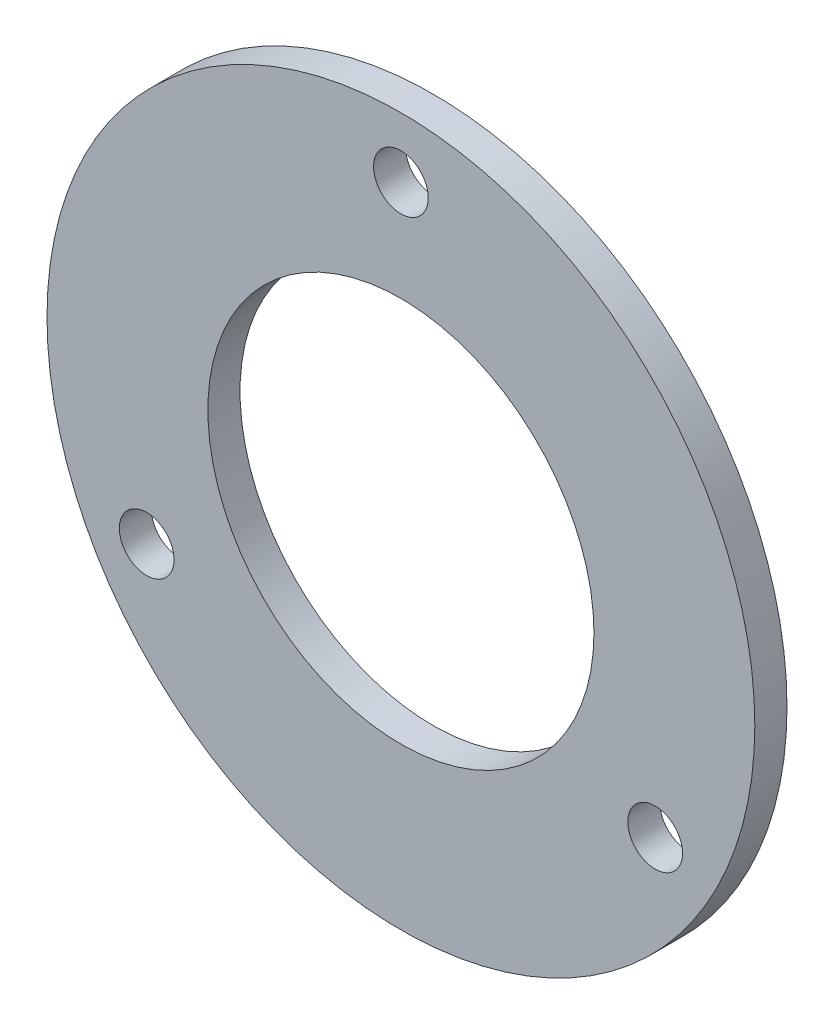
ISO-10303-21;
HEADER;
FILE_DESCRIPTION(('STEP AP214'),'2;1');
FILE_NAME('part.step','',(''),(''),'','','');
FILE_SCHEMA(('AUTOMOTIVE_DESIGN { 1 0 10303 214 1 1 1 1 }'));
ENDSEC;
DATA;
#1=APPLICATION_CONTEXT('core data for automotive mechanical design processes');
#2=APPLICATION_PROTOCOL_DEFINITION('international standard','automotive_design',2000,#1);
#3=PRODUCT_CONTEXT('',#1,'mechanical');
#4=PRODUCT('Part','Part','',(#3));
#5=PRODUCT_RELATED_PRODUCT_CATEGORY('part','',(#4));
#6=PRODUCT_DEFINITION_FORMATION('','',#4);
#7=PRODUCT_DEFINITION_CONTEXT('part definition',#1,'design');
#8=PRODUCT_DEFINITION('design','',#6,#7);
#9=PRODUCT_DEFINITION_SHAPE('','',#8);
#10=(LENGTH_UNIT() NAMED_UNIT(*) SI_UNIT(.MILLI.,.METRE.));
#11=(NAMED_UNIT(*) PLANE_ANGLE_UNIT() SI_UNIT($,.RADIAN.));
#12=(NAMED_UNIT(*) SI_UNIT($,.STERADIAN.) SOLID_ANGLE_UNIT());
#13=UNCERTAINTY_MEASURE_WITH_UNIT(LENGTH_MEASURE(1.E-05),#10,'distance_accuracy_value','');
#14=(GEOMETRIC_REPRESENTATION_CONTEXT(3) GLOBAL_UNCERTAINTY_ASSIGNED_CONTEXT((#13)) GLOBAL_UNIT_ASSIGNED_CONTEXT((#10,
#11,#12)) REPRESENTATION_CONTEXT('',''));
#15=CARTESIAN_POINT('',(0.,0.,0.));
#16=DIRECTION('',(0.,0.,1.));
#17=DIRECTION('',(1.,0.,0.));
#18=AXIS2_PLACEMENT_3D('',#15,#16,#17);
#19=CARTESIAN_POINT('',(0.,0.,2.));
#20=DIRECTION('',(0.,0.,1.));
#21=DIRECTION('',(1.,0.,0.));
#22=AXIS2_PLACEMENT_3D('',#19,#20,#21);
#23=PLANE('',#22);
#24=CARTESIAN_POINT('',(0.,18.25,2.));
#25=DIRECTION('',(0.,0.,1.));
#26=DIRECTION('',(1.,0.,0.));
#27=AXIS2_PLACEMENT_3D('',#24,#25,#26);
#28=CIRCLE('',#27,1.7);
#29=CARTESIAN_POINT('',(1.7,18.25,2.));
#30=VERTEX_POINT('',#29);
#31=EDGE_CURVE('E71',#30,#30,#28,.F.);
#32=ORIENTED_EDGE('',*,*,#31,.T.);
#33=EDGE_LOOP('',(#32));
#34=FACE_BOUND('',#33,.T.);
#35=CARTESIAN_POINT('',(-15.804963619066,-9.125,2.));
#36=DIRECTION('',(0.,0.,1.));
#37=DIRECTION('',(1.,0.,0.));
#38=AXIS2_PLACEMENT_3D('',#35,#36,#37);
#39=CIRCLE('',#38,1.7);
#40=CARTESIAN_POINT('',(-14.104963619066,-9.125,2.));
#41=VERTEX_POINT('',#40);
#42=EDGE_CURVE('E62',#41,#41,#39,.F.);
#43=ORIENTED_EDGE('',*,*,#42,.T.);
#44=EDGE_LOOP('',(#43));
#45=FACE_BOUND('',#44,.T.);
#46=CARTESIAN_POINT('',(15.804963619066,-9.12500000000001,2.));
#47=DIRECTION('',(0.,0.,1.));
#48=DIRECTION('',(1.,0.,0.));
#49=AXIS2_PLACEMENT_3D('',#46,#47,#48);
#50=CIRCLE('',#49,1.7);
#51=CARTESIAN_POINT('',(17.504963619066,-9.12500000000001,2.));
#52=VERTEX_POINT('',#51);
#53=EDGE_CURVE('E59',#52,#52,#50,.F.);
#54=ORIENTED_EDGE('',*,*,#53,.T.);
#55=EDGE_LOOP('',(#54));
#56=FACE_BOUND('',#55,.T.);
#57=CARTESIAN_POINT('',(0.,0.,2.));
#58=DIRECTION('',(0.,0.,1.));
#59=DIRECTION('',(1.,0.,0.));
#60=AXIS2_PLACEMENT_3D('',#57,#58,#59);
#61=CIRCLE('',#60,22.);
#62=CARTESIAN_POINT('',(22.,0.,2.));
#63=VERTEX_POINT('',#62);
#64=EDGE_CURVE('E10',#63,#63,#61,.T.);
#65=ORIENTED_EDGE('',*,*,#64,.T.);
#66=EDGE_LOOP('',(#65));
#67=FACE_BOUND('',#66,.T.);
#68=CARTESIAN_POINT('',(0.,0.,2.));
#69=DIRECTION('',(0.,0.,1.));
#70=DIRECTION('',(1.,0.,0.));
#71=AXIS2_PLACEMENT_3D('',#68,#69,#70);
#72=CIRCLE('',#71,12.);
#73=CARTESIAN_POINT('',(12.,0.,2.));
#74=VERTEX_POINT('',#73);
#75=EDGE_CURVE('E49',#74,#74,#72,.T.);
#76=ORIENTED_EDGE('',*,*,#75,.F.);
#77=EDGE_LOOP('',(#76));
#78=FACE_BOUND('',#77,.T.);
#79=ADVANCED_FACE('F40',(#34,#45,#56,#67,#78),#23,.T.);
#80=CARTESIAN_POINT('',(0.,0.,0.));
#81=DIRECTION('',(0.,0.,1.));
#82=DIRECTION('',(1.,0.,0.));
#83=AXIS2_PLACEMENT_3D('',#80,#81,#82);
#84=PLANE('',#83);
#85=CARTESIAN_POINT('',(0.,18.25,0.));
#86=DIRECTION('',(0.,0.,1.));
#87=DIRECTION('',(1.,0.,0.));
#88=AXIS2_PLACEMENT_3D('',#85,#86,#87);
#89=CIRCLE('',#88,1.7);
#90=CARTESIAN_POINT('',(1.7,18.25,0.));
#91=VERTEX_POINT('',#90);
#92=EDGE_CURVE('E41',#91,#91,#89,.F.);
#93=ORIENTED_EDGE('',*,*,#92,.F.);
#94=EDGE_LOOP('',(#93));
#95=FACE_BOUND('',#94,.T.);
#96=CARTESIAN_POINT('',(-15.804963619066,-9.125,0.));
#97=DIRECTION('',(0.,0.,1.));
#98=DIRECTION('',(1.,0.,0.));
#99=AXIS2_PLACEMENT_3D('',#96,#97,#98);
#100=CIRCLE('',#99,1.7);
#101=CARTESIAN_POINT('',(-14.104963619066,-9.125,0.));
#102=VERTEX_POINT('',#101);
#103=EDGE_CURVE('E56',#102,#102,#100,.F.);
#104=ORIENTED_EDGE('',*,*,#103,.F.);
#105=EDGE_LOOP('',(#104));
#106=FACE_BOUND('',#105,.T.);
#107=CARTESIAN_POINT('',(15.804963619066,-9.12500000000001,0.));
#108=DIRECTION('',(0.,0.,1.));
#109=DIRECTION('',(1.,0.,0.));
#110=AXIS2_PLACEMENT_3D('',#107,#108,#109);
#111=CIRCLE('',#110,1.7);
#112=CARTESIAN_POINT('',(17.504963619066,-9.12500000000001,0.));
#113=VERTEX_POINT('',#112);
#114=EDGE_CURVE('E57',#113,#113,#111,.F.);
#115=ORIENTED_EDGE('',*,*,#114,.F.);
#116=EDGE_LOOP('',(#115));
#117=FACE_BOUND('',#116,.T.);
#118=CARTESIAN_POINT('',(0.,0.,0.));
#119=DIRECTION('',(0.,0.,1.));
#120=DIRECTION('',(1.,0.,0.));
#121=AXIS2_PLACEMENT_3D('',#118,#119,#120);
#122=CIRCLE('',#121,22.);
#123=CARTESIAN_POINT('',(22.,0.,0.));
#124=VERTEX_POINT('',#123);
#125=EDGE_CURVE('E44',#124,#124,#122,.T.);
#126=ORIENTED_EDGE('',*,*,#125,.F.);
#127=EDGE_LOOP('',(#126));
#128=FACE_BOUND('',#127,.T.);
#129=CARTESIAN_POINT('',(0.,0.,0.));
#130=DIRECTION('',(0.,0.,1.));
#131=DIRECTION('',(1.,0.,0.));
#132=AXIS2_PLACEMENT_3D('',#129,#130,#131);
#133=CIRCLE('',#132,12.);
#134=CARTESIAN_POINT('',(12.,0.,0.));
#135=VERTEX_POINT('',#134);
#136=EDGE_CURVE('E52',#135,#135,#133,.T.);
#137=ORIENTED_EDGE('',*,*,#136,.T.);
#138=EDGE_LOOP('',(#137));
#139=FACE_BOUND('',#138,.T.);
#140=ADVANCED_FACE('F79',(#95,#106,#117,#128,#139),#84,.F.);
#141=CARTESIAN_POINT('',(0.,0.,2.));
#142=DIRECTION('',(0.,0.,-1.));
#143=DIRECTION('',(-1.,0.,0.));
#144=AXIS2_PLACEMENT_3D('',#141,#142,#143);
#145=CYLINDRICAL_SURFACE('',#144,22.);
#146=ORIENTED_EDGE('',*,*,#64,.F.);
#147=EDGE_LOOP('',(#146));
#148=FACE_BOUND('',#147,.T.);
#149=ORIENTED_EDGE('',*,*,#125,.T.);
#150=EDGE_LOOP('',(#149));
#151=FACE_BOUND('',#150,.T.);
#152=ADVANCED_FACE('F39',(#148,#151),#145,.T.);
#153=CARTESIAN_POINT('',(0.,0.,2.));
#154=DIRECTION('',(0.,0.,-1.));
#155=DIRECTION('',(-1.,0.,0.));
#156=AXIS2_PLACEMENT_3D('',#153,#154,#155);
#157=CYLINDRICAL_SURFACE('',#156,12.);
#158=ORIENTED_EDGE('',*,*,#75,.T.);
#159=EDGE_LOOP('',(#158));
#160=FACE_BOUND('',#159,.T.);
#161=ORIENTED_EDGE('',*,*,#136,.F.);
#162=EDGE_LOOP('',(#161));
#163=FACE_BOUND('',#162,.T.);
#164=ADVANCED_FACE('F82',(#160,#163),#157,.F.);
#165=CARTESIAN_POINT('',(15.804963619066,-9.12500000000001,3.));
#166=DIRECTION('',(0.,0.,-1.));
#167=DIRECTION('',(-1.,0.,0.));
#168=AXIS2_PLACEMENT_3D('',#165,#166,#167);
#169=CYLINDRICAL_SURFACE('',#168,1.7);
#170=ORIENTED_EDGE('',*,*,#53,.F.);
#171=EDGE_LOOP('',(#170));
#172=FACE_BOUND('',#171,.T.);
#173=ORIENTED_EDGE('',*,*,#114,.T.);
#174=EDGE_LOOP('',(#173));
#175=FACE_BOUND('',#174,.T.);
#176=ADVANCED_FACE('F84',(#172,#175),#169,.F.);
#177=CARTESIAN_POINT('',(-15.804963619066,-9.125,3.));
#178=DIRECTION('',(0.,0.,-1.));
#179=DIRECTION('',(-1.,0.,0.));
#180=AXIS2_PLACEMENT_3D('',#177,#178,#179);
#181=CYLINDRICAL_SURFACE('',#180,1.7);
#182=ORIENTED_EDGE('',*,*,#42,.F.);
#183=EDGE_LOOP('',(#182));
#184=FACE_BOUND('',#183,.T.);
#185=ORIENTED_EDGE('',*,*,#103,.T.);
#186=EDGE_LOOP('',(#185));
#187=FACE_BOUND('',#186,.T.);
#188=ADVANCED_FACE('F86',(#184,#187),#181,.F.);
#189=CARTESIAN_POINT('',(0.,18.25,3.));
#190=DIRECTION('',(0.,0.,-1.));
#191=DIRECTION('',(-1.,0.,0.));
#192=AXIS2_PLACEMENT_3D('',#189,#190,#191);
#193=CYLINDRICAL_SURFACE('',#192,1.7);
#194=ORIENTED_EDGE('',*,*,#31,.F.);
#195=EDGE_LOOP('',(#194));
#196=FACE_BOUND('',#195,.T.);
#197=ORIENTED_EDGE('',*,*,#92,.T.);
#198=EDGE_LOOP('',(#197));
#199=FACE_BOUND('',#198,.T.);
#200=ADVANCED_FACE('F106',(#196,#199),#193,.F.);
#201=CLOSED_SHELL('',(#79,#140,#152,#164,#176,#188,#200));
#202=MANIFOLD_SOLID_BREP('B2',#201);
#203=ADVANCED_BREP_SHAPE_REPRESENTATION('',(#18,#202),#14);
#204=SHAPE_DEFINITION_REPRESENTATION(#9,#203);
ENDSEC;
END-ISO-10303-21;
